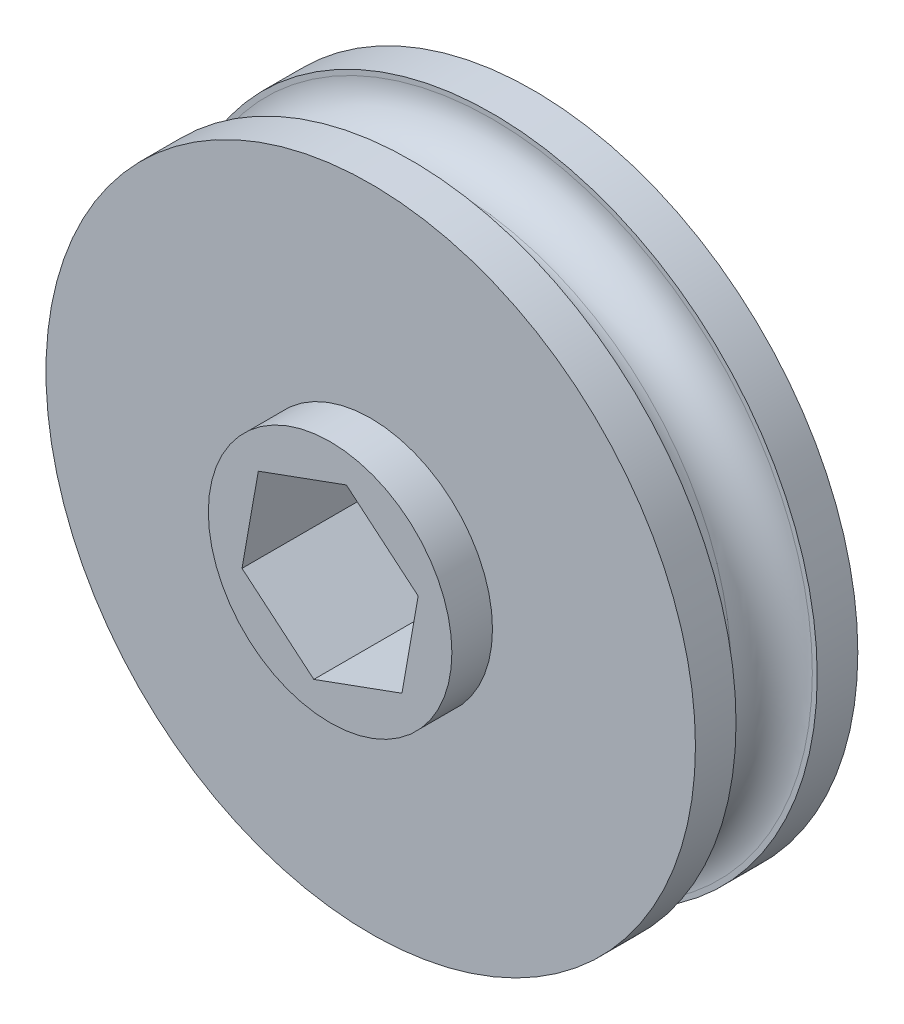
ISO-10303-21;
HEADER;
FILE_DESCRIPTION(('STEP AP214'),'2;1');
FILE_NAME('part.step','',(''),(''),'','','');
FILE_SCHEMA(('AUTOMOTIVE_DESIGN { 1 0 10303 214 1 1 1 1 }'));
ENDSEC;
DATA;
#1=APPLICATION_CONTEXT('core data for automotive mechanical design processes');
#2=APPLICATION_PROTOCOL_DEFINITION('international standard','automotive_design',2000,#1);
#3=PRODUCT_CONTEXT('',#1,'mechanical');
#4=PRODUCT('Part','Part','',(#3));
#5=PRODUCT_RELATED_PRODUCT_CATEGORY('part','',(#4));
#6=PRODUCT_DEFINITION_FORMATION('','',#4);
#7=PRODUCT_DEFINITION_CONTEXT('part definition',#1,'design');
#8=PRODUCT_DEFINITION('design','',#6,#7);
#9=PRODUCT_DEFINITION_SHAPE('','',#8);
#10=(LENGTH_UNIT() NAMED_UNIT(*) SI_UNIT(.MILLI.,.METRE.));
#11=(NAMED_UNIT(*) PLANE_ANGLE_UNIT() SI_UNIT($,.RADIAN.));
#12=(NAMED_UNIT(*) SI_UNIT($,.STERADIAN.) SOLID_ANGLE_UNIT());
#13=UNCERTAINTY_MEASURE_WITH_UNIT(LENGTH_MEASURE(1.E-05),#10,'distance_accuracy_value','');
#14=(GEOMETRIC_REPRESENTATION_CONTEXT(3) GLOBAL_UNCERTAINTY_ASSIGNED_CONTEXT((#13)) GLOBAL_UNIT_ASSIGNED_CONTEXT((#10,
#11,#12)) REPRESENTATION_CONTEXT('',''));
#15=CARTESIAN_POINT('',(0.,0.,0.));
#16=DIRECTION('',(0.,0.,1.));
#17=DIRECTION('',(1.,0.,0.));
#18=AXIS2_PLACEMENT_3D('',#15,#16,#17);
#19=CARTESIAN_POINT('',(0.,0.,12.7));
#20=DIRECTION('',(0.,0.,1.));
#21=DIRECTION('',(1.,0.,0.));
#22=AXIS2_PLACEMENT_3D('',#19,#20,#21);
#23=PLANE('',#22);
#24=CARTESIAN_POINT('',(0.,0.,12.7));
#25=DIRECTION('',(0.,0.,1.));
#26=DIRECTION('',(1.,0.,0.));
#27=AXIS2_PLACEMENT_3D('',#24,#25,#26);
#28=CIRCLE('',#27,25.4);
#29=CARTESIAN_POINT('',(25.4,0.,12.7));
#30=VERTEX_POINT('',#29);
#31=EDGE_CURVE('E151',#30,#30,#28,.T.);
#32=ORIENTED_EDGE('',*,*,#31,.T.);
#33=EDGE_LOOP('',(#32));
#34=FACE_BOUND('',#33,.T.);
#35=CARTESIAN_POINT('',(0.,0.,12.7));
#36=DIRECTION('',(0.,0.,1.));
#37=DIRECTION('',(1.,0.,0.));
#38=AXIS2_PLACEMENT_3D('',#35,#36,#37);
#39=CIRCLE('',#38,9.525);
#40=CARTESIAN_POINT('',(9.525,0.,12.7));
#41=VERTEX_POINT('',#40);
#42=EDGE_CURVE('E122',#41,#41,#39,.T.);
#43=ORIENTED_EDGE('',*,*,#42,.F.);
#44=EDGE_LOOP('',(#43));
#45=FACE_BOUND('',#44,.T.);
#46=ADVANCED_FACE('F32',(#34,#45),#23,.T.);
#47=CARTESIAN_POINT('',(0.,0.,12.7));
#48=DIRECTION('',(0.,0.,-1.));
#49=DIRECTION('',(-1.,0.,0.));
#50=AXIS2_PLACEMENT_3D('',#47,#48,#49);
#51=CYLINDRICAL_SURFACE('',#50,25.4);
#52=CARTESIAN_POINT('',(0.,0.,0.));
#53=DIRECTION('',(0.,0.,1.));
#54=DIRECTION('',(1.,0.,0.));
#55=AXIS2_PLACEMENT_3D('',#52,#53,#54);
#56=CIRCLE('',#55,25.4);
#57=CARTESIAN_POINT('',(25.4,0.,0.));
#58=VERTEX_POINT('',#57);
#59=EDGE_CURVE('E147',#58,#58,#56,.T.);
#60=ORIENTED_EDGE('',*,*,#59,.T.);
#61=EDGE_LOOP('',(#60));
#62=FACE_BOUND('',#61,.T.);
#63=CARTESIAN_POINT('',(0.,0.,3.175));
#64=DIRECTION('',(0.,0.,1.));
#65=DIRECTION('',(1.,0.,0.));
#66=AXIS2_PLACEMENT_3D('',#63,#64,#65);
#67=CIRCLE('',#66,25.4);
#68=CARTESIAN_POINT('',(25.4,0.,3.175));
#69=VERTEX_POINT('',#68);
#70=EDGE_CURVE('E144',#69,#69,#67,.T.);
#71=ORIENTED_EDGE('',*,*,#70,.F.);
#72=EDGE_LOOP('',(#71));
#73=FACE_BOUND('',#72,.T.);
#74=ADVANCED_FACE('F176',(#62,#73),#51,.T.);
#75=CARTESIAN_POINT('',(0.,0.,0.));
#76=DIRECTION('',(0.,0.,1.));
#77=DIRECTION('',(1.,0.,0.));
#78=AXIS2_PLACEMENT_3D('',#75,#76,#77);
#79=PLANE('',#78);
#80=DIRECTION('',(0.173570076525825,0.984821521157422,0.));
#81=VECTOR('',#80,1.);
#82=CARTESIAN_POINT('',(-5.61727852127503,4.71269724762323,0.));
#83=LINE('',#82,#81);
#84=CARTESIAN_POINT('',(-6.88995479742423,-2.50835727574525,0.));
#85=VERTEX_POINT('',#84);
#86=CARTESIAN_POINT('',(-5.61727852127503,4.71269724762323,0.));
#87=VERTEX_POINT('',#86);
#88=EDGE_CURVE('E132',#85,#87,#83,.T.);
#89=ORIENTED_EDGE('',*,*,#88,.F.);
#90=DIRECTION('',(-0.766095417253049,0.642726856186885,0.));
#91=VECTOR('',#90,1.);
#92=CARTESIAN_POINT('',(-6.88995479742423,-2.50835727574525,0.));
#93=LINE('',#92,#91);
#94=CARTESIAN_POINT('',(-1.27267627614921,-7.22105452336848,0.));
#95=VERTEX_POINT('',#94);
#96=EDGE_CURVE('E70',#95,#85,#93,.T.);
#97=ORIENTED_EDGE('',*,*,#96,.F.);
#98=DIRECTION('',(-0.939665493778874,-0.342094664970538,0.));
#99=VECTOR('',#98,1.);
#100=CARTESIAN_POINT('',(-1.27267627614921,-7.22105452336848,0.));
#101=LINE('',#100,#99);
#102=CARTESIAN_POINT('',(5.61727852127503,-4.71269724762322,0.));
#103=VERTEX_POINT('',#102);
#104=EDGE_CURVE('E77',#103,#95,#101,.T.);
#105=ORIENTED_EDGE('',*,*,#104,.F.);
#106=DIRECTION('',(-0.173570076525825,-0.984821521157422,0.));
#107=VECTOR('',#106,1.);
#108=CARTESIAN_POINT('',(5.61727852127503,-4.71269724762322,0.));
#109=LINE('',#108,#107);
#110=CARTESIAN_POINT('',(6.88995479742423,2.50835727574525,0.));
#111=VERTEX_POINT('',#110);
#112=EDGE_CURVE('E127',#111,#103,#109,.T.);
#113=ORIENTED_EDGE('',*,*,#112,.F.);
#114=DIRECTION('',(0.766095417253049,-0.642726856186885,0.));
#115=VECTOR('',#114,1.);
#116=CARTESIAN_POINT('',(6.88995479742423,2.50835727574525,0.));
#117=LINE('',#116,#115);
#118=CARTESIAN_POINT('',(1.27267627614921,7.22105452336848,0.));
#119=VERTEX_POINT('',#118);
#120=EDGE_CURVE('E57',#119,#111,#117,.T.);
#121=ORIENTED_EDGE('',*,*,#120,.F.);
#122=DIRECTION('',(0.939665493778874,0.342094664970537,0.));
#123=VECTOR('',#122,1.);
#124=CARTESIAN_POINT('',(1.27267627614921,7.22105452336848,0.));
#125=LINE('',#124,#123);
#126=EDGE_CURVE('E130',#87,#119,#125,.T.);
#127=ORIENTED_EDGE('',*,*,#126,.F.);
#128=EDGE_LOOP('',(#89,#97,#105,#113,#121,#127));
#129=FACE_BOUND('',#128,.T.);
#130=ORIENTED_EDGE('',*,*,#59,.F.);
#131=EDGE_LOOP('',(#130));
#132=FACE_BOUND('',#131,.T.);
#133=ADVANCED_FACE('F182',(#129,#132),#79,.F.);
#134=CARTESIAN_POINT('',(0.,0.,3.175));
#135=DIRECTION('',(0.,0.,1.));
#136=DIRECTION('',(1.,0.,0.));
#137=AXIS2_PLACEMENT_3D('',#134,#135,#136);
#138=PLANE('',#137);
#139=CARTESIAN_POINT('',(0.,0.,3.175));
#140=DIRECTION('',(0.,0.,1.));
#141=DIRECTION('',(1.,0.,0.));
#142=AXIS2_PLACEMENT_3D('',#139,#140,#141);
#143=CIRCLE('',#142,25.019);
#144=CARTESIAN_POINT('',(25.019,0.,3.175));
#145=VERTEX_POINT('',#144);
#146=EDGE_CURVE('E11',#145,#145,#143,.F.);
#147=ORIENTED_EDGE('',*,*,#146,.T.);
#148=EDGE_LOOP('',(#147));
#149=FACE_BOUND('',#148,.T.);
#150=ORIENTED_EDGE('',*,*,#70,.T.);
#151=EDGE_LOOP('',(#150));
#152=FACE_BOUND('',#151,.T.);
#153=ADVANCED_FACE('F189',(#149,#152),#138,.T.);
#154=CARTESIAN_POINT('',(0.,0.,9.525));
#155=DIRECTION('',(0.,0.,1.));
#156=DIRECTION('',(1.,0.,0.));
#157=AXIS2_PLACEMENT_3D('',#154,#155,#156);
#158=PLANE('',#157);
#159=CARTESIAN_POINT('',(0.,0.,9.525));
#160=DIRECTION('',(0.,0.,1.));
#161=DIRECTION('',(1.,0.,0.));
#162=AXIS2_PLACEMENT_3D('',#159,#160,#161);
#163=CIRCLE('',#162,25.019);
#164=CARTESIAN_POINT('',(25.019,0.,9.525));
#165=VERTEX_POINT('',#164);
#166=EDGE_CURVE('E41',#165,#165,#163,.T.);
#167=ORIENTED_EDGE('',*,*,#166,.T.);
#168=EDGE_LOOP('',(#167));
#169=FACE_BOUND('',#168,.T.);
#170=CARTESIAN_POINT('',(0.,0.,9.525));
#171=DIRECTION('',(0.,0.,1.));
#172=DIRECTION('',(1.,0.,0.));
#173=AXIS2_PLACEMENT_3D('',#170,#171,#172);
#174=CIRCLE('',#173,25.4);
#175=CARTESIAN_POINT('',(25.4,0.,9.525));
#176=VERTEX_POINT('',#175);
#177=EDGE_CURVE('E148',#176,#176,#174,.T.);
#178=ORIENTED_EDGE('',*,*,#177,.F.);
#179=EDGE_LOOP('',(#178));
#180=FACE_BOUND('',#179,.T.);
#181=ADVANCED_FACE('F159',(#169,#180),#158,.F.);
#182=ORIENTED_EDGE('',*,*,#177,.T.);
#183=EDGE_LOOP('',(#182));
#184=FACE_BOUND('',#183,.T.);
#185=ORIENTED_EDGE('',*,*,#31,.F.);
#186=EDGE_LOOP('',(#185));
#187=FACE_BOUND('',#186,.T.);
#188=ADVANCED_FACE('F171',(#184,#187),#51,.T.);
#189=CARTESIAN_POINT('',(0.,0.,6.35));
#190=DIRECTION('',(0.,0.,1.));
#191=DIRECTION('',(1.,0.,0.));
#192=AXIS2_PLACEMENT_3D('',#189,#190,#191);
#193=TOROIDAL_SURFACE('',#192,25.019,3.175);
#194=ORIENTED_EDGE('',*,*,#146,.F.);
#195=EDGE_LOOP('',(#194));
#196=FACE_BOUND('',#195,.T.);
#197=CARTESIAN_POINT('',(0.,0.,6.35));
#198=DIRECTION('',(0.,0.,1.));
#199=DIRECTION('',(1.,0.,0.));
#200=AXIS2_PLACEMENT_3D('',#197,#198,#199);
#201=CIRCLE('',#200,21.844);
#202=CARTESIAN_POINT('',(21.844,0.,6.35));
#203=VERTEX_POINT('',#202);
#204=EDGE_CURVE('E36',#203,#203,#201,.T.);
#205=ORIENTED_EDGE('',*,*,#204,.F.);
#206=EDGE_LOOP('',(#205));
#207=FACE_BOUND('',#206,.T.);
#208=ADVANCED_FACE('F34',(#196,#207),#193,.F.);
#209=CARTESIAN_POINT('',(0.,0.,6.35));
#210=DIRECTION('',(0.,0.,1.));
#211=DIRECTION('',(1.,0.,0.));
#212=AXIS2_PLACEMENT_3D('',#209,#210,#211);
#213=TOROIDAL_SURFACE('',#212,25.019,3.175);
#214=ORIENTED_EDGE('',*,*,#204,.T.);
#215=EDGE_LOOP('',(#214));
#216=FACE_BOUND('',#215,.T.);
#217=ORIENTED_EDGE('',*,*,#166,.F.);
#218=EDGE_LOOP('',(#217));
#219=FACE_BOUND('',#218,.T.);
#220=ADVANCED_FACE('F162',(#216,#219),#213,.F.);
#221=CARTESIAN_POINT('',(-6.88995479742423,-2.50835727574525,-19.9614734466181));
#222=DIRECTION('',(-0.642726856186885,-0.766095417253049,0.));
#223=DIRECTION('',(0.766095417253049,-0.642726856186885,0.));
#224=AXIS2_PLACEMENT_3D('',#221,#222,#223);
#225=PLANE('',#224);
#226=ORIENTED_EDGE('',*,*,#96,.T.);
#227=DIRECTION('',(0.,0.,1.));
#228=VECTOR('',#227,1.);
#229=CARTESIAN_POINT('',(-6.88995479742423,-2.50835727574525,-19.9614734466181));
#230=LINE('',#229,#228);
#231=CARTESIAN_POINT('',(-6.8899547974242,-2.50835727574532,15.875));
#232=VERTEX_POINT('',#231);
#233=EDGE_CURVE('E102',#85,#232,#230,.T.);
#234=ORIENTED_EDGE('',*,*,#233,.T.);
#235=DIRECTION('',(0.766095417253056,-0.642726856186877,0.));
#236=VECTOR('',#235,1.);
#237=CARTESIAN_POINT('',(-6.8899547974242,-2.50835727574532,15.875));
#238=LINE('',#237,#236);
#239=CARTESIAN_POINT('',(-1.27267627614913,-7.22105452336849,15.875));
#240=VERTEX_POINT('',#239);
#241=EDGE_CURVE('E100',#232,#240,#238,.T.);
#242=ORIENTED_EDGE('',*,*,#241,.T.);
#243=DIRECTION('',(0.,0.,1.));
#244=VECTOR('',#243,1.);
#245=CARTESIAN_POINT('',(-1.27267627614921,-7.22105452336848,-19.9614734466181));
#246=LINE('',#245,#244);
#247=EDGE_CURVE('E91',#95,#240,#246,.T.);
#248=ORIENTED_EDGE('',*,*,#247,.F.);
#249=EDGE_LOOP('',(#226,#234,#242,#248));
#250=FACE_BOUND('',#249,.T.);
#251=ADVANCED_FACE('F101',(#250),#225,.F.);
#252=CARTESIAN_POINT('',(-5.61727852127503,4.71269724762323,-19.9614734466181));
#253=DIRECTION('',(-0.984821521157422,0.173570076525825,0.));
#254=DIRECTION('',(-0.173570076525825,-0.984821521157422,0.));
#255=AXIS2_PLACEMENT_3D('',#252,#253,#254);
#256=PLANE('',#255);
#257=ORIENTED_EDGE('',*,*,#88,.T.);
#258=DIRECTION('',(0.,0.,1.));
#259=VECTOR('',#258,1.);
#260=CARTESIAN_POINT('',(-5.61727852127503,4.71269724762323,-19.9614734466181));
#261=LINE('',#260,#259);
#262=CARTESIAN_POINT('',(-5.61727852127507,4.71269724762317,15.875));
#263=VERTEX_POINT('',#262);
#264=EDGE_CURVE('E136',#87,#263,#261,.T.);
#265=ORIENTED_EDGE('',*,*,#264,.T.);
#266=DIRECTION('',(-0.173570076525815,-0.984821521157424,0.));
#267=VECTOR('',#266,1.);
#268=CARTESIAN_POINT('',(-5.61727852127507,4.71269724762317,15.875));
#269=LINE('',#268,#267);
#270=EDGE_CURVE('E120',#263,#232,#269,.T.);
#271=ORIENTED_EDGE('',*,*,#270,.T.);
#272=ORIENTED_EDGE('',*,*,#233,.F.);
#273=EDGE_LOOP('',(#257,#265,#271,#272));
#274=FACE_BOUND('',#273,.T.);
#275=ADVANCED_FACE('F169',(#274),#256,.F.);
#276=CARTESIAN_POINT('',(1.27267627614921,7.22105452336848,-19.9614734466181));
#277=DIRECTION('',(-0.342094664970537,0.939665493778874,0.));
#278=DIRECTION('',(-0.939665493778874,-0.342094664970537,0.));
#279=AXIS2_PLACEMENT_3D('',#276,#277,#278);
#280=PLANE('',#279);
#281=ORIENTED_EDGE('',*,*,#126,.T.);
#282=DIRECTION('',(0.,0.,1.));
#283=VECTOR('',#282,1.);
#284=CARTESIAN_POINT('',(1.27267627614921,7.22105452336848,-19.9614734466181));
#285=LINE('',#284,#283);
#286=CARTESIAN_POINT('',(1.27267627614913,7.22105452336849,15.875));
#287=VERTEX_POINT('',#286);
#288=EDGE_CURVE('E138',#119,#287,#285,.T.);
#289=ORIENTED_EDGE('',*,*,#288,.T.);
#290=DIRECTION('',(-0.939665493778871,-0.342094664970547,0.));
#291=VECTOR('',#290,1.);
#292=CARTESIAN_POINT('',(1.27267627614913,7.22105452336849,15.875));
#293=LINE('',#292,#291);
#294=EDGE_CURVE('E117',#287,#263,#293,.T.);
#295=ORIENTED_EDGE('',*,*,#294,.T.);
#296=ORIENTED_EDGE('',*,*,#264,.F.);
#297=EDGE_LOOP('',(#281,#289,#295,#296));
#298=FACE_BOUND('',#297,.T.);
#299=ADVANCED_FACE('F216',(#298),#280,.F.);
#300=CARTESIAN_POINT('',(6.88995479742423,2.50835727574525,-19.9614734466181));
#301=DIRECTION('',(0.642726856186885,0.766095417253049,0.));
#302=DIRECTION('',(-0.766095417253049,0.642726856186885,0.));
#303=AXIS2_PLACEMENT_3D('',#300,#301,#302);
#304=PLANE('',#303);
#305=ORIENTED_EDGE('',*,*,#120,.T.);
#306=DIRECTION('',(0.,0.,1.));
#307=VECTOR('',#306,1.);
#308=CARTESIAN_POINT('',(6.88995479742423,2.50835727574525,-19.9614734466181));
#309=LINE('',#308,#307);
#310=CARTESIAN_POINT('',(6.8899547974242,2.50835727574532,15.875));
#311=VERTEX_POINT('',#310);
#312=EDGE_CURVE('E140',#111,#311,#309,.T.);
#313=ORIENTED_EDGE('',*,*,#312,.T.);
#314=DIRECTION('',(-0.766095417253055,0.642726856186877,0.));
#315=VECTOR('',#314,1.);
#316=CARTESIAN_POINT('',(6.8899547974242,2.50835727574532,15.875));
#317=LINE('',#316,#315);
#318=EDGE_CURVE('E112',#311,#287,#317,.T.);
#319=ORIENTED_EDGE('',*,*,#318,.T.);
#320=ORIENTED_EDGE('',*,*,#288,.F.);
#321=EDGE_LOOP('',(#305,#313,#319,#320));
#322=FACE_BOUND('',#321,.T.);
#323=ADVANCED_FACE('F212',(#322),#304,.F.);
#324=CARTESIAN_POINT('',(5.61727852127503,-4.71269724762322,-19.9614734466181));
#325=DIRECTION('',(0.984821521157422,-0.173570076525825,0.));
#326=DIRECTION('',(0.173570076525825,0.984821521157422,0.));
#327=AXIS2_PLACEMENT_3D('',#324,#325,#326);
#328=PLANE('',#327);
#329=ORIENTED_EDGE('',*,*,#112,.T.);
#330=DIRECTION('',(0.,0.,1.));
#331=VECTOR('',#330,1.);
#332=CARTESIAN_POINT('',(5.61727852127503,-4.71269724762322,-19.9614734466181));
#333=LINE('',#332,#331);
#334=CARTESIAN_POINT('',(5.61727852127507,-4.71269724762317,15.875));
#335=VERTEX_POINT('',#334);
#336=EDGE_CURVE('E48',#103,#335,#333,.T.);
#337=ORIENTED_EDGE('',*,*,#336,.T.);
#338=DIRECTION('',(0.173570076525815,0.984821521157424,0.));
#339=VECTOR('',#338,1.);
#340=CARTESIAN_POINT('',(5.61727852127507,-4.71269724762317,15.875));
#341=LINE('',#340,#339);
#342=EDGE_CURVE('E110',#335,#311,#341,.T.);
#343=ORIENTED_EDGE('',*,*,#342,.T.);
#344=ORIENTED_EDGE('',*,*,#312,.F.);
#345=EDGE_LOOP('',(#329,#337,#343,#344));
#346=FACE_BOUND('',#345,.T.);
#347=ADVANCED_FACE('F209',(#346),#328,.F.);
#348=CARTESIAN_POINT('',(-1.27267627614921,-7.22105452336848,-19.9614734466181));
#349=DIRECTION('',(0.342094664970538,-0.939665493778874,0.));
#350=DIRECTION('',(0.939665493778874,0.342094664970538,0.));
#351=AXIS2_PLACEMENT_3D('',#348,#349,#350);
#352=PLANE('',#351);
#353=ORIENTED_EDGE('',*,*,#104,.T.);
#354=ORIENTED_EDGE('',*,*,#247,.T.);
#355=DIRECTION('',(0.939665493778871,0.342094664970547,0.));
#356=VECTOR('',#355,1.);
#357=CARTESIAN_POINT('',(-1.27267627614913,-7.22105452336849,15.875));
#358=LINE('',#357,#356);
#359=EDGE_CURVE('E95',#240,#335,#358,.T.);
#360=ORIENTED_EDGE('',*,*,#359,.T.);
#361=ORIENTED_EDGE('',*,*,#336,.F.);
#362=EDGE_LOOP('',(#353,#354,#360,#361));
#363=FACE_BOUND('',#362,.T.);
#364=ADVANCED_FACE('F93',(#363),#352,.F.);
#365=CARTESIAN_POINT('',(0.,0.,15.875));
#366=DIRECTION('',(0.,0.,1.));
#367=DIRECTION('',(1.,0.,0.));
#368=AXIS2_PLACEMENT_3D('',#365,#366,#367);
#369=PLANE('',#368);
#370=CARTESIAN_POINT('',(0.,0.,15.875));
#371=DIRECTION('',(0.,0.,1.));
#372=DIRECTION('',(1.,0.,0.));
#373=AXIS2_PLACEMENT_3D('',#370,#371,#372);
#374=CIRCLE('',#373,9.525);
#375=CARTESIAN_POINT('',(9.525,0.,15.875));
#376=VERTEX_POINT('',#375);
#377=EDGE_CURVE('E97',#376,#376,#374,.T.);
#378=ORIENTED_EDGE('',*,*,#377,.T.);
#379=EDGE_LOOP('',(#378));
#380=FACE_BOUND('',#379,.T.);
#381=ORIENTED_EDGE('',*,*,#359,.F.);
#382=ORIENTED_EDGE('',*,*,#241,.F.);
#383=ORIENTED_EDGE('',*,*,#270,.F.);
#384=ORIENTED_EDGE('',*,*,#294,.F.);
#385=ORIENTED_EDGE('',*,*,#318,.F.);
#386=ORIENTED_EDGE('',*,*,#342,.F.);
#387=EDGE_LOOP('',(#381,#382,#383,#384,#385,#386));
#388=FACE_BOUND('',#387,.T.);
#389=ADVANCED_FACE('F107',(#380,#388),#369,.T.);
#390=CARTESIAN_POINT('',(0.,0.,15.875));
#391=DIRECTION('',(0.,0.,-1.));
#392=DIRECTION('',(-1.,0.,0.));
#393=AXIS2_PLACEMENT_3D('',#390,#391,#392);
#394=CYLINDRICAL_SURFACE('',#393,9.525);
#395=ORIENTED_EDGE('',*,*,#377,.F.);
#396=EDGE_LOOP('',(#395));
#397=FACE_BOUND('',#396,.T.);
#398=ORIENTED_EDGE('',*,*,#42,.T.);
#399=EDGE_LOOP('',(#398));
#400=FACE_BOUND('',#399,.T.);
#401=ADVANCED_FACE('F223',(#397,#400),#394,.T.);
#402=CLOSED_SHELL('',(#46,#74,#133,#153,#181,#188,#208,#220,#251,#275,#299,#323,#347,#364,#389,#401));
#403=MANIFOLD_SOLID_BREP('B2',#402);
#404=ADVANCED_BREP_SHAPE_REPRESENTATION('',(#18,#403),#14);
#405=SHAPE_DEFINITION_REPRESENTATION(#9,#404);
ENDSEC;
END-ISO-10303-21;
